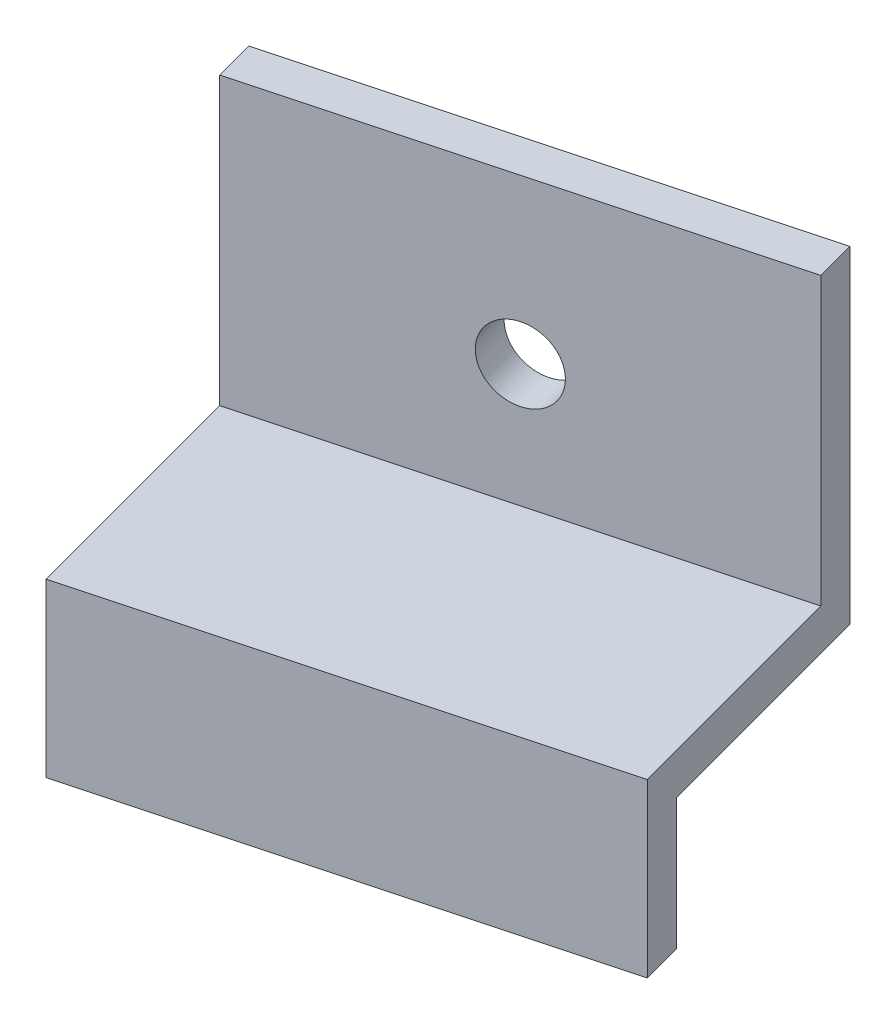
ISO-10303-21;
HEADER;
FILE_DESCRIPTION(('STEP AP214'),'2;1');
FILE_NAME('part.step','',(''),(''),'','','');
FILE_SCHEMA(('AUTOMOTIVE_DESIGN { 1 0 10303 214 1 1 1 1 }'));
ENDSEC;
DATA;
#1=APPLICATION_CONTEXT('core data for automotive mechanical design processes');
#2=APPLICATION_PROTOCOL_DEFINITION('international standard','automotive_design',2000,#1);
#3=PRODUCT_CONTEXT('',#1,'mechanical');
#4=PRODUCT('Part','Part','',(#3));
#5=PRODUCT_RELATED_PRODUCT_CATEGORY('part','',(#4));
#6=PRODUCT_DEFINITION_FORMATION('','',#4);
#7=PRODUCT_DEFINITION_CONTEXT('part definition',#1,'design');
#8=PRODUCT_DEFINITION('design','',#6,#7);
#9=PRODUCT_DEFINITION_SHAPE('','',#8);
#10=(LENGTH_UNIT() NAMED_UNIT(*) SI_UNIT(.MILLI.,.METRE.));
#11=(NAMED_UNIT(*) PLANE_ANGLE_UNIT() SI_UNIT($,.RADIAN.));
#12=(NAMED_UNIT(*) SI_UNIT($,.STERADIAN.) SOLID_ANGLE_UNIT());
#13=UNCERTAINTY_MEASURE_WITH_UNIT(LENGTH_MEASURE(1.E-05),#10,'distance_accuracy_value','');
#14=(GEOMETRIC_REPRESENTATION_CONTEXT(3) GLOBAL_UNCERTAINTY_ASSIGNED_CONTEXT((#13)) GLOBAL_UNIT_ASSIGNED_CONTEXT((#10,
#11,#12)) REPRESENTATION_CONTEXT('',''));
#15=CARTESIAN_POINT('',(0.,0.,0.));
#16=DIRECTION('',(0.,0.,1.));
#17=DIRECTION('',(1.,0.,0.));
#18=AXIS2_PLACEMENT_3D('',#15,#16,#17);
#19=CARTESIAN_POINT('',(-1831.43983092,1747.,3472.338378297));
#20=DIRECTION('',(-0.258819045102985,0.,-0.965925826288944));
#21=DIRECTION('',(0.965925826288944,0.,-0.258819045102985));
#22=AXIS2_PLACEMENT_3D('',#19,#20,#21);
#23=CYLINDRICAL_SURFACE('',#22,4.5);
#24=CARTESIAN_POINT('',(-1831.413949015,1747.,3472.43497088));
#25=DIRECTION('',(-0.258819045102985,0.,-0.965925826288944));
#26=DIRECTION('',(0.965925826288944,0.,-0.258819045102985));
#27=AXIS2_PLACEMENT_3D('',#24,#25,#26);
#28=CIRCLE('',#27,4.5);
#29=CARTESIAN_POINT('',(-1827.067282797,1747.,3471.270285177));
#30=VERTEX_POINT('',#29);
#31=EDGE_CURVE('E173',#30,#30,#28,.T.);
#32=ORIENTED_EDGE('',*,*,#31,.T.);
#33=DIRECTION('',(0.258819045102985,0.,0.965925826288944));
#34=VECTOR('',#33,1.);
#35=CARTESIAN_POINT('',(-1827.093164702,1747.,3471.173692594));
#36=LINE('',#35,#34);
#37=CARTESIAN_POINT('',(-1825.773187572,1747.,3476.099914308));
#38=VERTEX_POINT('',#37);
#39=EDGE_CURVE('E11',#30,#38,#36,.T.);
#40=ORIENTED_EDGE('',*,*,#39,.T.);
#41=CARTESIAN_POINT('',(-1830.11985379,1747.,3477.264600011));
#42=DIRECTION('',(-0.258819045102985,0.,-0.965925826288944));
#43=DIRECTION('',(0.965925826288944,0.,-0.258819045102985));
#44=AXIS2_PLACEMENT_3D('',#41,#42,#43);
#45=CIRCLE('',#44,4.5);
#46=EDGE_CURVE('E197',#38,#38,#45,.T.);
#47=ORIENTED_EDGE('',*,*,#46,.F.);
#48=ORIENTED_EDGE('',*,*,#39,.F.);
#49=EDGE_LOOP('',(#32,#40,#47,#48));
#50=FACE_BOUND('',#49,.T.);
#51=ADVANCED_FACE('F17',(#50),#23,.F.);
#52=CARTESIAN_POINT('',(-1802.436174227,1727.,3464.670399527));
#53=DIRECTION('',(0.965925826288944,0.,-0.258819045102985));
#54=DIRECTION('',(0.,-1.,0.));
#55=AXIS2_PLACEMENT_3D('',#52,#53,#54);
#56=PLANE('',#55);
#57=DIRECTION('',(0.258819045102985,0.,0.965925826288944));
#58=VECTOR('',#57,1.);
#59=CARTESIAN_POINT('',(-1802.436174227,1727.,3464.670399527));
#60=LINE('',#59,#58);
#61=CARTESIAN_POINT('',(-1802.436174227,1727.,3464.670399527));
#62=VERTEX_POINT('',#61);
#63=CARTESIAN_POINT('',(-1794.671602874,1727.,3493.648174315));
#64=VERTEX_POINT('',#63);
#65=EDGE_CURVE('E165',#62,#64,#60,.T.);
#66=ORIENTED_EDGE('',*,*,#65,.F.);
#67=DIRECTION('',(0.,1.,0.));
#68=VECTOR('',#67,1.);
#69=CARTESIAN_POINT('',(-1802.436174227,1727.,3464.670399527));
#70=LINE('',#69,#68);
#71=CARTESIAN_POINT('',(-1802.436174227,1767.,3464.670399527));
#72=VERTEX_POINT('',#71);
#73=EDGE_CURVE('E177',#62,#72,#70,.T.);
#74=ORIENTED_EDGE('',*,*,#73,.T.);
#75=DIRECTION('',(0.258819045102985,0.,0.965925826288944));
#76=VECTOR('',#75,1.);
#77=CARTESIAN_POINT('',(-1802.436174227,1767.,3464.670399527));
#78=LINE('',#77,#76);
#79=CARTESIAN_POINT('',(-1801.142079001,1767.,3469.500028658));
#80=VERTEX_POINT('',#79);
#81=EDGE_CURVE('E154',#72,#80,#78,.T.);
#82=ORIENTED_EDGE('',*,*,#81,.T.);
#83=DIRECTION('',(0.,1.,0.));
#84=VECTOR('',#83,1.);
#85=CARTESIAN_POINT('',(-1801.142079001,1727.,3469.500028658));
#86=LINE('',#85,#84);
#87=CARTESIAN_POINT('',(-1801.142079001,1732.,3469.500028658));
#88=VERTEX_POINT('',#87);
#89=EDGE_CURVE('E194',#88,#80,#86,.T.);
#90=ORIENTED_EDGE('',*,*,#89,.F.);
#91=DIRECTION('',(0.258819045102985,0.,0.965925826288944));
#92=VECTOR('',#91,1.);
#93=CARTESIAN_POINT('',(-1801.142079001,1732.,3469.500028658));
#94=LINE('',#93,#92);
#95=CARTESIAN_POINT('',(-1793.377507648,1732.,3498.477803447));
#96=VERTEX_POINT('',#95);
#97=EDGE_CURVE('E201',#88,#96,#94,.T.);
#98=ORIENTED_EDGE('',*,*,#97,.T.);
#99=DIRECTION('',(0.,-1.,0.));
#100=VECTOR('',#99,1.);
#101=CARTESIAN_POINT('',(-1793.377507648,1732.,3498.477803447));
#102=LINE('',#101,#100);
#103=CARTESIAN_POINT('',(-1793.377507648,1711.,3498.477803447));
#104=VERTEX_POINT('',#103);
#105=EDGE_CURVE('E137',#96,#104,#102,.T.);
#106=ORIENTED_EDGE('',*,*,#105,.T.);
#107=DIRECTION('',(0.258819045102985,0.,0.965925826288944));
#108=VECTOR('',#107,1.);
#109=CARTESIAN_POINT('',(-1794.671602874,1711.,3493.648174315));
#110=LINE('',#109,#108);
#111=CARTESIAN_POINT('',(-1794.671602874,1711.,3493.648174315));
#112=VERTEX_POINT('',#111);
#113=EDGE_CURVE('E45',#112,#104,#110,.T.);
#114=ORIENTED_EDGE('',*,*,#113,.F.);
#115=DIRECTION('',(0.,1.,0.));
#116=VECTOR('',#115,1.);
#117=CARTESIAN_POINT('',(-1794.671602874,1711.,3493.648174315));
#118=LINE('',#117,#116);
#119=EDGE_CURVE('E25',#112,#64,#118,.T.);
#120=ORIENTED_EDGE('',*,*,#119,.T.);
#121=EDGE_LOOP('',(#66,#74,#82,#90,#98,#106,#114,#120));
#122=FACE_BOUND('',#121,.T.);
#123=ADVANCED_FACE('F215',(#122),#56,.T.);
#124=CARTESIAN_POINT('',(-1852.627152451,1711.,3509.177317021));
#125=DIRECTION('',(0.258819045102985,0.,0.965925826288944));
#126=DIRECTION('',(0.,-1.,0.));
#127=AXIS2_PLACEMENT_3D('',#124,#125,#126);
#128=PLANE('',#127);
#129=DIRECTION('',(0.965925826288944,0.,-0.258819045102985));
#130=VECTOR('',#129,1.);
#131=CARTESIAN_POINT('',(-1852.627152451,1727.,3509.177317021));
#132=LINE('',#131,#130);
#133=CARTESIAN_POINT('',(-1852.627152451,1727.,3509.177317021));
#134=VERTEX_POINT('',#133);
#135=EDGE_CURVE('E169',#134,#64,#132,.T.);
#136=ORIENTED_EDGE('',*,*,#135,.T.);
#137=ORIENTED_EDGE('',*,*,#119,.F.);
#138=DIRECTION('',(0.965925826288944,0.,-0.258819045102985));
#139=VECTOR('',#138,1.);
#140=CARTESIAN_POINT('',(-1852.627152451,1711.,3509.177317021));
#141=LINE('',#140,#139);
#142=CARTESIAN_POINT('',(-1852.627152451,1711.,3509.177317021));
#143=VERTEX_POINT('',#142);
#144=EDGE_CURVE('E108',#143,#112,#141,.T.);
#145=ORIENTED_EDGE('',*,*,#144,.F.);
#146=DIRECTION('',(0.,1.,0.));
#147=VECTOR('',#146,1.);
#148=CARTESIAN_POINT('',(-1852.627152451,1711.,3509.177317021));
#149=LINE('',#148,#147);
#150=EDGE_CURVE('E112',#143,#134,#149,.T.);
#151=ORIENTED_EDGE('',*,*,#150,.T.);
#152=EDGE_LOOP('',(#136,#137,#145,#151));
#153=FACE_BOUND('',#152,.T.);
#154=ADVANCED_FACE('F110',(#153),#128,.F.);
#155=CARTESIAN_POINT('',(-1852.627152451,1711.,3509.177317021));
#156=DIRECTION('',(0.,1.,0.));
#157=DIRECTION('',(1.,0.,0.));
#158=AXIS2_PLACEMENT_3D('',#155,#156,#157);
#159=PLANE('',#158);
#160=ORIENTED_EDGE('',*,*,#113,.T.);
#161=DIRECTION('',(0.965925826288944,0.,-0.258819045102985));
#162=VECTOR('',#161,1.);
#163=CARTESIAN_POINT('',(-1851.333057226,1711.,3514.006946153));
#164=LINE('',#163,#162);
#165=CARTESIAN_POINT('',(-1851.333057226,1711.,3514.006946153));
#166=VERTEX_POINT('',#165);
#167=EDGE_CURVE('E119',#166,#104,#164,.T.);
#168=ORIENTED_EDGE('',*,*,#167,.F.);
#169=DIRECTION('',(0.258819045102985,0.,0.965925826288944));
#170=VECTOR('',#169,1.);
#171=CARTESIAN_POINT('',(-1852.627152451,1711.,3509.177317021));
#172=LINE('',#171,#170);
#173=EDGE_CURVE('E116',#143,#166,#172,.T.);
#174=ORIENTED_EDGE('',*,*,#173,.F.);
#175=ORIENTED_EDGE('',*,*,#144,.T.);
#176=EDGE_LOOP('',(#160,#168,#174,#175));
#177=FACE_BOUND('',#176,.T.);
#178=ADVANCED_FACE('F117',(#177),#159,.F.);
#179=CARTESIAN_POINT('',(-1851.333057226,1727.,3514.006946153));
#180=DIRECTION('',(0.258819045102985,0.,0.965925826288944));
#181=DIRECTION('',(0.,-1.,0.));
#182=AXIS2_PLACEMENT_3D('',#179,#180,#181);
#183=PLANE('',#182);
#184=DIRECTION('',(0.,1.,0.));
#185=VECTOR('',#184,1.);
#186=CARTESIAN_POINT('',(-1851.333057226,1711.,3514.006946153));
#187=LINE('',#186,#185);
#188=CARTESIAN_POINT('',(-1851.333057226,1732.,3514.006946153));
#189=VERTEX_POINT('',#188);
#190=EDGE_CURVE('E124',#166,#189,#187,.T.);
#191=ORIENTED_EDGE('',*,*,#190,.F.);
#192=ORIENTED_EDGE('',*,*,#167,.T.);
#193=ORIENTED_EDGE('',*,*,#105,.F.);
#194=DIRECTION('',(0.965925826288944,0.,-0.258819045102985));
#195=VECTOR('',#194,1.);
#196=CARTESIAN_POINT('',(-1851.333057226,1732.,3514.006946153));
#197=LINE('',#196,#195);
#198=EDGE_CURVE('E138',#189,#96,#197,.T.);
#199=ORIENTED_EDGE('',*,*,#198,.F.);
#200=EDGE_LOOP('',(#191,#192,#193,#199));
#201=FACE_BOUND('',#200,.T.);
#202=ADVANCED_FACE('F231',(#201),#183,.T.);
#203=CARTESIAN_POINT('',(-1859.097628579,1732.,3485.029171364));
#204=DIRECTION('',(0.,1.,0.));
#205=DIRECTION('',(1.,0.,0.));
#206=AXIS2_PLACEMENT_3D('',#203,#204,#205);
#207=PLANE('',#206);
#208=ORIENTED_EDGE('',*,*,#97,.F.);
#209=DIRECTION('',(0.965925826288944,0.,-0.258819045102985));
#210=VECTOR('',#209,1.);
#211=CARTESIAN_POINT('',(-1859.097628579,1732.,3485.029171364));
#212=LINE('',#211,#210);
#213=CARTESIAN_POINT('',(-1859.097628579,1732.,3485.029171364));
#214=VERTEX_POINT('',#213);
#215=EDGE_CURVE('E158',#214,#88,#212,.T.);
#216=ORIENTED_EDGE('',*,*,#215,.F.);
#217=DIRECTION('',(-0.258819045102985,0.,-0.965925826288944));
#218=VECTOR('',#217,1.);
#219=CARTESIAN_POINT('',(-1851.333057226,1732.,3514.006946153));
#220=LINE('',#219,#218);
#221=EDGE_CURVE('E143',#189,#214,#220,.T.);
#222=ORIENTED_EDGE('',*,*,#221,.F.);
#223=ORIENTED_EDGE('',*,*,#198,.T.);
#224=EDGE_LOOP('',(#208,#216,#222,#223));
#225=FACE_BOUND('',#224,.T.);
#226=ADVANCED_FACE('F229',(#225),#207,.T.);
#227=CARTESIAN_POINT('',(-1859.097628579,1727.,3485.029171364));
#228=DIRECTION('',(0.258819045102985,0.,0.965925826288944));
#229=DIRECTION('',(0.,-1.,0.));
#230=AXIS2_PLACEMENT_3D('',#227,#228,#229);
#231=PLANE('',#230);
#232=ORIENTED_EDGE('',*,*,#46,.T.);
#233=EDGE_LOOP('',(#232));
#234=FACE_BOUND('',#233,.T.);
#235=DIRECTION('',(0.,1.,0.));
#236=VECTOR('',#235,1.);
#237=CARTESIAN_POINT('',(-1859.097628579,1727.,3485.029171364));
#238=LINE('',#237,#236);
#239=CARTESIAN_POINT('',(-1859.097628579,1767.,3485.029171364));
#240=VERTEX_POINT('',#239);
#241=EDGE_CURVE('E139',#214,#240,#238,.T.);
#242=ORIENTED_EDGE('',*,*,#241,.F.);
#243=ORIENTED_EDGE('',*,*,#215,.T.);
#244=ORIENTED_EDGE('',*,*,#89,.T.);
#245=DIRECTION('',(0.965925826288944,0.,-0.258819045102985));
#246=VECTOR('',#245,1.);
#247=CARTESIAN_POINT('',(-1859.097628579,1767.,3485.029171364));
#248=LINE('',#247,#246);
#249=EDGE_CURVE('E159',#240,#80,#248,.T.);
#250=ORIENTED_EDGE('',*,*,#249,.F.);
#251=EDGE_LOOP('',(#242,#243,#244,#250));
#252=FACE_BOUND('',#251,.T.);
#253=ADVANCED_FACE('F226',(#234,#252),#231,.T.);
#254=CARTESIAN_POINT('',(-1860.391723804,1767.,3480.199542233));
#255=DIRECTION('',(0.,1.,0.));
#256=DIRECTION('',(1.,0.,0.));
#257=AXIS2_PLACEMENT_3D('',#254,#255,#256);
#258=PLANE('',#257);
#259=DIRECTION('',(0.965925826288944,0.,-0.258819045102985));
#260=VECTOR('',#259,1.);
#261=CARTESIAN_POINT('',(-1860.391723804,1767.,3480.199542233));
#262=LINE('',#261,#260);
#263=CARTESIAN_POINT('',(-1860.391723804,1767.,3480.199542233));
#264=VERTEX_POINT('',#263);
#265=EDGE_CURVE('E181',#264,#72,#262,.T.);
#266=ORIENTED_EDGE('',*,*,#265,.F.);
#267=DIRECTION('',(0.258819045102985,0.,0.965925826288944));
#268=VECTOR('',#267,1.);
#269=CARTESIAN_POINT('',(-1860.391723804,1767.,3480.199542233));
#270=LINE('',#269,#268);
#271=EDGE_CURVE('E142',#264,#240,#270,.T.);
#272=ORIENTED_EDGE('',*,*,#271,.T.);
#273=ORIENTED_EDGE('',*,*,#249,.T.);
#274=ORIENTED_EDGE('',*,*,#81,.F.);
#275=EDGE_LOOP('',(#266,#272,#273,#274));
#276=FACE_BOUND('',#275,.T.);
#277=ADVANCED_FACE('F223',(#276),#258,.T.);
#278=CARTESIAN_POINT('',(-1860.391723804,1727.,3480.199542233));
#279=DIRECTION('',(0.258819045102985,0.,0.965925826288944));
#280=DIRECTION('',(0.,-1.,0.));
#281=AXIS2_PLACEMENT_3D('',#278,#279,#280);
#282=PLANE('',#281);
#283=ORIENTED_EDGE('',*,*,#31,.F.);
#284=EDGE_LOOP('',(#283));
#285=FACE_BOUND('',#284,.T.);
#286=ORIENTED_EDGE('',*,*,#265,.T.);
#287=ORIENTED_EDGE('',*,*,#73,.F.);
#288=DIRECTION('',(0.965925826288944,0.,-0.258819045102985));
#289=VECTOR('',#288,1.);
#290=CARTESIAN_POINT('',(-1860.391723804,1727.,3480.199542233));
#291=LINE('',#290,#289);
#292=CARTESIAN_POINT('',(-1860.391723804,1727.,3480.199542233));
#293=VERTEX_POINT('',#292);
#294=EDGE_CURVE('E172',#293,#62,#291,.T.);
#295=ORIENTED_EDGE('',*,*,#294,.F.);
#296=DIRECTION('',(0.,1.,0.));
#297=VECTOR('',#296,1.);
#298=CARTESIAN_POINT('',(-1860.391723804,1727.,3480.199542233));
#299=LINE('',#298,#297);
#300=EDGE_CURVE('E145',#293,#264,#299,.T.);
#301=ORIENTED_EDGE('',*,*,#300,.T.);
#302=EDGE_LOOP('',(#286,#287,#295,#301));
#303=FACE_BOUND('',#302,.T.);
#304=ADVANCED_FACE('F219',(#285,#303),#282,.F.);
#305=CARTESIAN_POINT('',(-1860.391723804,1727.,3480.199542233));
#306=DIRECTION('',(0.,1.,0.));
#307=DIRECTION('',(1.,0.,0.));
#308=AXIS2_PLACEMENT_3D('',#305,#306,#307);
#309=PLANE('',#308);
#310=ORIENTED_EDGE('',*,*,#65,.T.);
#311=ORIENTED_EDGE('',*,*,#135,.F.);
#312=DIRECTION('',(0.258819045102985,0.,0.965925826288944));
#313=VECTOR('',#312,1.);
#314=CARTESIAN_POINT('',(-1860.391723804,1727.,3480.199542233));
#315=LINE('',#314,#313);
#316=EDGE_CURVE('E130',#293,#134,#315,.T.);
#317=ORIENTED_EDGE('',*,*,#316,.F.);
#318=ORIENTED_EDGE('',*,*,#294,.T.);
#319=EDGE_LOOP('',(#310,#311,#317,#318));
#320=FACE_BOUND('',#319,.T.);
#321=ADVANCED_FACE('F217',(#320),#309,.F.);
#322=CARTESIAN_POINT('',(-1860.391723804,1727.,3480.199542233));
#323=DIRECTION('',(0.965925826288944,0.,-0.258819045102985));
#324=DIRECTION('',(0.,-1.,0.));
#325=AXIS2_PLACEMENT_3D('',#322,#323,#324);
#326=PLANE('',#325);
#327=ORIENTED_EDGE('',*,*,#150,.F.);
#328=ORIENTED_EDGE('',*,*,#173,.T.);
#329=ORIENTED_EDGE('',*,*,#190,.T.);
#330=ORIENTED_EDGE('',*,*,#221,.T.);
#331=ORIENTED_EDGE('',*,*,#241,.T.);
#332=ORIENTED_EDGE('',*,*,#271,.F.);
#333=ORIENTED_EDGE('',*,*,#300,.F.);
#334=ORIENTED_EDGE('',*,*,#316,.T.);
#335=EDGE_LOOP('',(#327,#328,#329,#330,#331,#332,#333,#334));
#336=FACE_BOUND('',#335,.T.);
#337=ADVANCED_FACE('F127',(#336),#326,.F.);
#338=CLOSED_SHELL('',(#51,#123,#154,#178,#202,#226,#253,#277,#304,#321,#337));
#339=MANIFOLD_SOLID_BREP('B1',#338);
#340=ADVANCED_BREP_SHAPE_REPRESENTATION('',(#18,#339),#14);
#341=SHAPE_DEFINITION_REPRESENTATION(#9,#340);
ENDSEC;
END-ISO-10303-21;
